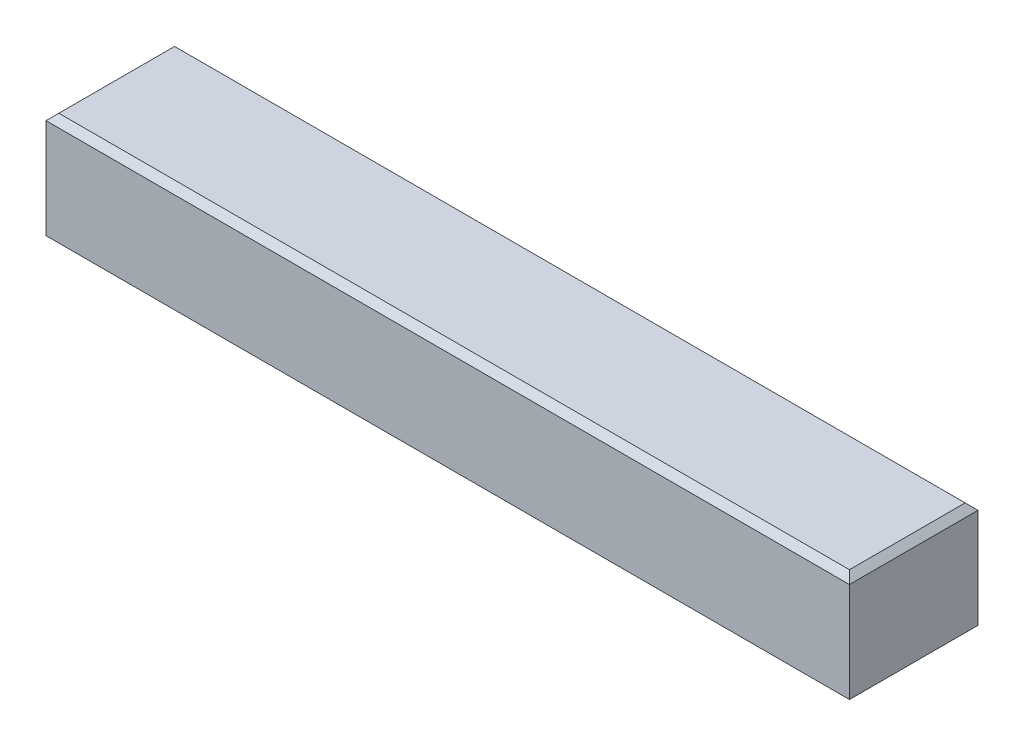
ISO-10303-21;
HEADER;
FILE_DESCRIPTION(('STEP AP214'),'2;1');
FILE_NAME('part.step','',(''),(''),'','','');
FILE_SCHEMA(('AUTOMOTIVE_DESIGN { 1 0 10303 214 1 1 1 1 }'));
ENDSEC;
DATA;
#1=APPLICATION_CONTEXT('core data for automotive mechanical design processes');
#2=APPLICATION_PROTOCOL_DEFINITION('international standard','automotive_design',2000,#1);
#3=PRODUCT_CONTEXT('',#1,'mechanical');
#4=PRODUCT('Part','Part','',(#3));
#5=PRODUCT_RELATED_PRODUCT_CATEGORY('part','',(#4));
#6=PRODUCT_DEFINITION_FORMATION('','',#4);
#7=PRODUCT_DEFINITION_CONTEXT('part definition',#1,'design');
#8=PRODUCT_DEFINITION('design','',#6,#7);
#9=PRODUCT_DEFINITION_SHAPE('','',#8);
#10=(LENGTH_UNIT() NAMED_UNIT(*) SI_UNIT(.MILLI.,.METRE.));
#11=(NAMED_UNIT(*) PLANE_ANGLE_UNIT() SI_UNIT($,.RADIAN.));
#12=(NAMED_UNIT(*) SI_UNIT($,.STERADIAN.) SOLID_ANGLE_UNIT());
#13=UNCERTAINTY_MEASURE_WITH_UNIT(LENGTH_MEASURE(1.E-05),#10,'distance_accuracy_value','');
#14=(GEOMETRIC_REPRESENTATION_CONTEXT(3) GLOBAL_UNCERTAINTY_ASSIGNED_CONTEXT((#13)) GLOBAL_UNIT_ASSIGNED_CONTEXT((#10,
#11,#12)) REPRESENTATION_CONTEXT('',''));
#15=CARTESIAN_POINT('',(0.,0.,0.));
#16=DIRECTION('',(0.,0.,1.));
#17=DIRECTION('',(1.,0.,0.));
#18=AXIS2_PLACEMENT_3D('',#15,#16,#17);
#19=CARTESIAN_POINT('',(0.,3.5,0.));
#20=DIRECTION('',(1.,0.,0.));
#21=DIRECTION('',(0.,0.,-1.));
#22=AXIS2_PLACEMENT_3D('',#19,#20,#21);
#23=PLANE('',#22);
#24=DIRECTION('',(0.,0.,-1.));
#25=VECTOR('',#24,1.);
#26=CARTESIAN_POINT('',(0.,6.6,2.));
#27=LINE('',#26,#25);
#28=CARTESIAN_POINT('',(0.,6.6,4.));
#29=VERTEX_POINT('',#28);
#30=CARTESIAN_POINT('',(0.,6.6,-4.));
#31=VERTEX_POINT('',#30);
#32=EDGE_CURVE('E147',#29,#31,#27,.T.);
#33=ORIENTED_EDGE('',*,*,#32,.T.);
#34=DIRECTION('',(0.,1.,0.));
#35=VECTOR('',#34,1.);
#36=CARTESIAN_POINT('',(0.,0.4,-4.));
#37=LINE('',#36,#35);
#38=CARTESIAN_POINT('',(0.,0.4,-4.));
#39=VERTEX_POINT('',#38);
#40=EDGE_CURVE('E11',#39,#31,#37,.T.);
#41=ORIENTED_EDGE('',*,*,#40,.F.);
#42=DIRECTION('',(0.,0.,1.));
#43=VECTOR('',#42,1.);
#44=CARTESIAN_POINT('',(0.,0.4,2.));
#45=LINE('',#44,#43);
#46=CARTESIAN_POINT('',(0.,0.4,4.));
#47=VERTEX_POINT('',#46);
#48=EDGE_CURVE('E133',#39,#47,#45,.T.);
#49=ORIENTED_EDGE('',*,*,#48,.T.);
#50=DIRECTION('',(0.,-1.,0.));
#51=VECTOR('',#50,1.);
#52=CARTESIAN_POINT('',(0.,6.6,4.));
#53=LINE('',#52,#51);
#54=EDGE_CURVE('E25',#29,#47,#53,.T.);
#55=ORIENTED_EDGE('',*,*,#54,.F.);
#56=EDGE_LOOP('',(#33,#41,#49,#55));
#57=FACE_BOUND('',#56,.T.);
#58=ADVANCED_FACE('F16',(#57),#23,.F.);
#59=CARTESIAN_POINT('',(0.,3.5,-4.));
#60=DIRECTION('',(0.,0.,-1.));
#61=DIRECTION('',(0.,1.,0.));
#62=AXIS2_PLACEMENT_3D('',#59,#60,#61);
#63=PLANE('',#62);
#64=DIRECTION('',(0.,-1.,0.));
#65=VECTOR('',#64,1.);
#66=CARTESIAN_POINT('',(50.,0.4,-4.));
#67=LINE('',#66,#65);
#68=CARTESIAN_POINT('',(50.,6.6,-4.));
#69=VERTEX_POINT('',#68);
#70=CARTESIAN_POINT('',(50.,0.4,-4.));
#71=VERTEX_POINT('',#70);
#72=EDGE_CURVE('E85',#69,#71,#67,.T.);
#73=ORIENTED_EDGE('',*,*,#72,.T.);
#74=DIRECTION('',(1.,0.,0.));
#75=VECTOR('',#74,1.);
#76=CARTESIAN_POINT('',(0.,0.4,-4.));
#77=LINE('',#76,#75);
#78=EDGE_CURVE('E131',#39,#71,#77,.T.);
#79=ORIENTED_EDGE('',*,*,#78,.F.);
#80=ORIENTED_EDGE('',*,*,#40,.T.);
#81=DIRECTION('',(1.,0.,0.));
#82=VECTOR('',#81,1.);
#83=CARTESIAN_POINT('',(0.,6.6,-4.));
#84=LINE('',#83,#82);
#85=EDGE_CURVE('E110',#31,#69,#84,.T.);
#86=ORIENTED_EDGE('',*,*,#85,.T.);
#87=EDGE_LOOP('',(#73,#79,#80,#86));
#88=FACE_BOUND('',#87,.T.);
#89=ADVANCED_FACE('F179',(#88),#63,.T.);
#90=CARTESIAN_POINT('',(0.,6.8,3.8));
#91=DIRECTION('',(0.,0.707106781186547,0.707106781186548));
#92=DIRECTION('',(0.,-0.707106781186548,0.707106781186547));
#93=AXIS2_PLACEMENT_3D('',#90,#91,#92);
#94=PLANE('',#93);
#95=DIRECTION('',(-0.577350269189626,-0.577350269189626,0.577350269189626));
#96=VECTOR('',#95,1.);
#97=CARTESIAN_POINT('',(0.133333333333333,6.73333333333333,3.86666666666666));
#98=LINE('',#97,#96);
#99=CARTESIAN_POINT('',(0.4,7.,3.6));
#100=VERTEX_POINT('',#99);
#101=EDGE_CURVE('E121',#100,#29,#98,.T.);
#102=ORIENTED_EDGE('',*,*,#101,.T.);
#103=DIRECTION('',(1.,0.,0.));
#104=VECTOR('',#103,1.);
#105=CARTESIAN_POINT('',(0.,6.6,4.));
#106=LINE('',#105,#104);
#107=CARTESIAN_POINT('',(50.,6.6,4.));
#108=VERTEX_POINT('',#107);
#109=EDGE_CURVE('E142',#29,#108,#106,.T.);
#110=ORIENTED_EDGE('',*,*,#109,.T.);
#111=DIRECTION('',(-0.577350269189623,0.577350269189627,-0.577350269189627));
#112=VECTOR('',#111,1.);
#113=CARTESIAN_POINT('',(41.5333333333334,15.0666666666667,-4.46666666666664));
#114=LINE('',#113,#112);
#115=CARTESIAN_POINT('',(49.6,7.,3.6));
#116=VERTEX_POINT('',#115);
#117=EDGE_CURVE('E101',#108,#116,#114,.T.);
#118=ORIENTED_EDGE('',*,*,#117,.T.);
#119=DIRECTION('',(1.,0.,0.));
#120=VECTOR('',#119,1.);
#121=CARTESIAN_POINT('',(0.,7.,3.6));
#122=LINE('',#121,#120);
#123=EDGE_CURVE('E98',#100,#116,#122,.T.);
#124=ORIENTED_EDGE('',*,*,#123,.F.);
#125=EDGE_LOOP('',(#102,#110,#118,#124));
#126=FACE_BOUND('',#125,.T.);
#127=ADVANCED_FACE('F157',(#126),#94,.T.);
#128=CARTESIAN_POINT('',(0.,3.5,4.));
#129=DIRECTION('',(0.,0.,1.));
#130=DIRECTION('',(0.,-1.,0.));
#131=AXIS2_PLACEMENT_3D('',#128,#129,#130);
#132=PLANE('',#131);
#133=DIRECTION('',(0.,1.,0.));
#134=VECTOR('',#133,1.);
#135=CARTESIAN_POINT('',(50.,6.6,4.));
#136=LINE('',#135,#134);
#137=CARTESIAN_POINT('',(50.,0.4,4.));
#138=VERTEX_POINT('',#137);
#139=EDGE_CURVE('E124',#138,#108,#136,.T.);
#140=ORIENTED_EDGE('',*,*,#139,.T.);
#141=ORIENTED_EDGE('',*,*,#109,.F.);
#142=ORIENTED_EDGE('',*,*,#54,.T.);
#143=DIRECTION('',(1.,0.,0.));
#144=VECTOR('',#143,1.);
#145=CARTESIAN_POINT('',(0.,0.4,4.));
#146=LINE('',#145,#144);
#147=EDGE_CURVE('E156',#47,#138,#146,.T.);
#148=ORIENTED_EDGE('',*,*,#147,.T.);
#149=EDGE_LOOP('',(#140,#141,#142,#148));
#150=FACE_BOUND('',#149,.T.);
#151=ADVANCED_FACE('F159',(#150),#132,.T.);
#152=CARTESIAN_POINT('',(0.,0.2,3.8));
#153=DIRECTION('',(0.,-0.707106781186548,0.707106781186548));
#154=DIRECTION('',(0.,-0.707106781186548,-0.707106781186548));
#155=AXIS2_PLACEMENT_3D('',#152,#153,#154);
#156=PLANE('',#155);
#157=DIRECTION('',(0.577350269189623,0.577350269189627,0.577350269189627));
#158=VECTOR('',#157,1.);
#159=CARTESIAN_POINT('',(41.5333333333334,-8.06666666666665,-4.46666666666665));
#160=LINE('',#159,#158);
#161=CARTESIAN_POINT('',(49.6,0.,3.6));
#162=VERTEX_POINT('',#161);
#163=EDGE_CURVE('E137',#162,#138,#160,.T.);
#164=ORIENTED_EDGE('',*,*,#163,.T.);
#165=ORIENTED_EDGE('',*,*,#147,.F.);
#166=DIRECTION('',(0.577350269189626,-0.577350269189626,-0.577350269189626));
#167=VECTOR('',#166,1.);
#168=CARTESIAN_POINT('',(0.133333333333333,0.266666666666666,3.86666666666666));
#169=LINE('',#168,#167);
#170=CARTESIAN_POINT('',(0.4,0.,3.6));
#171=VERTEX_POINT('',#170);
#172=EDGE_CURVE('E136',#47,#171,#169,.T.);
#173=ORIENTED_EDGE('',*,*,#172,.T.);
#174=DIRECTION('',(1.,0.,0.));
#175=VECTOR('',#174,1.);
#176=CARTESIAN_POINT('',(0.,0.,3.6));
#177=LINE('',#176,#175);
#178=EDGE_CURVE('E19',#171,#162,#177,.T.);
#179=ORIENTED_EDGE('',*,*,#178,.T.);
#180=EDGE_LOOP('',(#164,#165,#173,#179));
#181=FACE_BOUND('',#180,.T.);
#182=ADVANCED_FACE('F168',(#181),#156,.T.);
#183=CARTESIAN_POINT('',(0.2,0.2,4.));
#184=DIRECTION('',(0.707106781186548,0.707106781186548,0.));
#185=DIRECTION('',(0.707106781186548,-0.707106781186548,0.));
#186=AXIS2_PLACEMENT_3D('',#183,#184,#185);
#187=PLANE('',#186);
#188=ORIENTED_EDGE('',*,*,#48,.F.);
#189=DIRECTION('',(-0.577350269189626,0.577350269189626,-0.577350269189626));
#190=VECTOR('',#189,1.);
#191=CARTESIAN_POINT('',(1.46666666666667,-1.06666666666667,-2.53333333333333));
#192=LINE('',#191,#190);
#193=CARTESIAN_POINT('',(0.4,0.,-3.6));
#194=VERTEX_POINT('',#193);
#195=EDGE_CURVE('E127',#194,#39,#192,.T.);
#196=ORIENTED_EDGE('',*,*,#195,.F.);
#197=DIRECTION('',(0.,0.,-1.));
#198=VECTOR('',#197,1.);
#199=CARTESIAN_POINT('',(0.4,0.,2.));
#200=LINE('',#199,#198);
#201=EDGE_CURVE('E54',#171,#194,#200,.T.);
#202=ORIENTED_EDGE('',*,*,#201,.F.);
#203=ORIENTED_EDGE('',*,*,#172,.F.);
#204=EDGE_LOOP('',(#188,#196,#202,#203));
#205=FACE_BOUND('',#204,.T.);
#206=ADVANCED_FACE('F184',(#205),#187,.F.);
#207=CARTESIAN_POINT('',(0.,0.,0.));
#208=DIRECTION('',(0.,-1.,0.));
#209=DIRECTION('',(0.,0.,-1.));
#210=AXIS2_PLACEMENT_3D('',#207,#208,#209);
#211=PLANE('',#210);
#212=DIRECTION('',(0.,0.,1.));
#213=VECTOR('',#212,1.);
#214=CARTESIAN_POINT('',(49.6,0.,2.));
#215=LINE('',#214,#213);
#216=CARTESIAN_POINT('',(49.6,0.,-3.6));
#217=VERTEX_POINT('',#216);
#218=EDGE_CURVE('E130',#217,#162,#215,.T.);
#219=ORIENTED_EDGE('',*,*,#218,.T.);
#220=ORIENTED_EDGE('',*,*,#178,.F.);
#221=ORIENTED_EDGE('',*,*,#201,.T.);
#222=DIRECTION('',(1.,0.,0.));
#223=VECTOR('',#222,1.);
#224=CARTESIAN_POINT('',(0.,0.,-3.6));
#225=LINE('',#224,#223);
#226=EDGE_CURVE('E61',#194,#217,#225,.T.);
#227=ORIENTED_EDGE('',*,*,#226,.T.);
#228=EDGE_LOOP('',(#219,#220,#221,#227));
#229=FACE_BOUND('',#228,.T.);
#230=ADVANCED_FACE('F173',(#229),#211,.T.);
#231=CARTESIAN_POINT('',(0.,0.2,-3.8));
#232=DIRECTION('',(0.,-0.707106781186548,-0.707106781186547));
#233=DIRECTION('',(0.,0.707106781186547,-0.707106781186548));
#234=AXIS2_PLACEMENT_3D('',#231,#232,#233);
#235=PLANE('',#234);
#236=DIRECTION('',(-0.577350269189623,-0.577350269189627,0.577350269189627));
#237=VECTOR('',#236,1.);
#238=CARTESIAN_POINT('',(40.2,-9.4,5.8));
#239=LINE('',#238,#237);
#240=EDGE_CURVE('E128',#71,#217,#239,.T.);
#241=ORIENTED_EDGE('',*,*,#240,.T.);
#242=ORIENTED_EDGE('',*,*,#226,.F.);
#243=ORIENTED_EDGE('',*,*,#195,.T.);
#244=ORIENTED_EDGE('',*,*,#78,.T.);
#245=EDGE_LOOP('',(#241,#242,#243,#244));
#246=FACE_BOUND('',#245,.T.);
#247=ADVANCED_FACE('F181',(#246),#235,.T.);
#248=CARTESIAN_POINT('',(49.8,0.2,4.));
#249=DIRECTION('',(-0.70710678118655,0.707106781186545,0.));
#250=DIRECTION('',(0.707106781186545,0.70710678118655,0.));
#251=AXIS2_PLACEMENT_3D('',#248,#249,#250);
#252=PLANE('',#251);
#253=DIRECTION('',(0.,0.,-1.));
#254=VECTOR('',#253,1.);
#255=CARTESIAN_POINT('',(50.,0.400000000000005,2.));
#256=LINE('',#255,#254);
#257=EDGE_CURVE('E123',#138,#71,#256,.T.);
#258=ORIENTED_EDGE('',*,*,#257,.F.);
#259=ORIENTED_EDGE('',*,*,#163,.F.);
#260=ORIENTED_EDGE('',*,*,#218,.F.);
#261=ORIENTED_EDGE('',*,*,#240,.F.);
#262=EDGE_LOOP('',(#258,#259,#260,#261));
#263=FACE_BOUND('',#262,.T.);
#264=ADVANCED_FACE('F176',(#263),#252,.F.);
#265=CARTESIAN_POINT('',(50.,3.5,0.));
#266=DIRECTION('',(1.,0.,0.));
#267=DIRECTION('',(0.,0.,-1.));
#268=AXIS2_PLACEMENT_3D('',#265,#266,#267);
#269=PLANE('',#268);
#270=DIRECTION('',(0.,0.,1.));
#271=VECTOR('',#270,1.);
#272=CARTESIAN_POINT('',(50.,6.6,2.));
#273=LINE('',#272,#271);
#274=EDGE_CURVE('E106',#69,#108,#273,.T.);
#275=ORIENTED_EDGE('',*,*,#274,.T.);
#276=ORIENTED_EDGE('',*,*,#139,.F.);
#277=ORIENTED_EDGE('',*,*,#257,.T.);
#278=ORIENTED_EDGE('',*,*,#72,.F.);
#279=EDGE_LOOP('',(#275,#276,#277,#278));
#280=FACE_BOUND('',#279,.T.);
#281=ADVANCED_FACE('F161',(#280),#269,.T.);
#282=CARTESIAN_POINT('',(49.8,6.8,4.));
#283=DIRECTION('',(-0.70710678118655,-0.707106781186545,0.));
#284=DIRECTION('',(-0.707106781186545,0.70710678118655,0.));
#285=AXIS2_PLACEMENT_3D('',#282,#283,#284);
#286=PLANE('',#285);
#287=ORIENTED_EDGE('',*,*,#117,.F.);
#288=ORIENTED_EDGE('',*,*,#274,.F.);
#289=DIRECTION('',(0.577350269189623,-0.577350269189627,-0.577350269189627));
#290=VECTOR('',#289,1.);
#291=CARTESIAN_POINT('',(40.2,16.4,5.8));
#292=LINE('',#291,#290);
#293=CARTESIAN_POINT('',(49.6,7.,-3.6));
#294=VERTEX_POINT('',#293);
#295=EDGE_CURVE('E104',#294,#69,#292,.T.);
#296=ORIENTED_EDGE('',*,*,#295,.F.);
#297=DIRECTION('',(0.,0.,-1.));
#298=VECTOR('',#297,1.);
#299=CARTESIAN_POINT('',(49.6,7.,2.));
#300=LINE('',#299,#298);
#301=EDGE_CURVE('E91',#116,#294,#300,.T.);
#302=ORIENTED_EDGE('',*,*,#301,.F.);
#303=EDGE_LOOP('',(#287,#288,#296,#302));
#304=FACE_BOUND('',#303,.T.);
#305=ADVANCED_FACE('F105',(#304),#286,.F.);
#306=CARTESIAN_POINT('',(0.,7.,0.));
#307=DIRECTION('',(0.,1.,0.));
#308=DIRECTION('',(0.,0.,1.));
#309=AXIS2_PLACEMENT_3D('',#306,#307,#308);
#310=PLANE('',#309);
#311=DIRECTION('',(0.,0.,1.));
#312=VECTOR('',#311,1.);
#313=CARTESIAN_POINT('',(0.4,7.,2.));
#314=LINE('',#313,#312);
#315=CARTESIAN_POINT('',(0.4,7.,-3.6));
#316=VERTEX_POINT('',#315);
#317=EDGE_CURVE('E117',#316,#100,#314,.T.);
#318=ORIENTED_EDGE('',*,*,#317,.T.);
#319=ORIENTED_EDGE('',*,*,#123,.T.);
#320=ORIENTED_EDGE('',*,*,#301,.T.);
#321=DIRECTION('',(1.,0.,0.));
#322=VECTOR('',#321,1.);
#323=CARTESIAN_POINT('',(0.,7.,-3.6));
#324=LINE('',#323,#322);
#325=EDGE_CURVE('E96',#316,#294,#324,.T.);
#326=ORIENTED_EDGE('',*,*,#325,.F.);
#327=EDGE_LOOP('',(#318,#319,#320,#326));
#328=FACE_BOUND('',#327,.T.);
#329=ADVANCED_FACE('F94',(#328),#310,.T.);
#330=CARTESIAN_POINT('',(0.,6.8,-3.8));
#331=DIRECTION('',(0.,0.707106781186548,-0.707106781186548));
#332=DIRECTION('',(0.,0.707106781186548,0.707106781186548));
#333=AXIS2_PLACEMENT_3D('',#330,#331,#332);
#334=PLANE('',#333);
#335=DIRECTION('',(0.577350269189626,0.577350269189626,0.577350269189626));
#336=VECTOR('',#335,1.);
#337=CARTESIAN_POINT('',(1.46666666666667,8.06666666666667,-2.53333333333333));
#338=LINE('',#337,#336);
#339=EDGE_CURVE('E114',#31,#316,#338,.T.);
#340=ORIENTED_EDGE('',*,*,#339,.T.);
#341=ORIENTED_EDGE('',*,*,#325,.T.);
#342=ORIENTED_EDGE('',*,*,#295,.T.);
#343=ORIENTED_EDGE('',*,*,#85,.F.);
#344=EDGE_LOOP('',(#340,#341,#342,#343));
#345=FACE_BOUND('',#344,.T.);
#346=ADVANCED_FACE('F112',(#345),#334,.T.);
#347=CARTESIAN_POINT('',(0.2,6.8,4.));
#348=DIRECTION('',(0.707106781186548,-0.707106781186547,0.));
#349=DIRECTION('',(-0.707106781186547,-0.707106781186548,0.));
#350=AXIS2_PLACEMENT_3D('',#347,#348,#349);
#351=PLANE('',#350);
#352=ORIENTED_EDGE('',*,*,#32,.F.);
#353=ORIENTED_EDGE('',*,*,#101,.F.);
#354=ORIENTED_EDGE('',*,*,#317,.F.);
#355=ORIENTED_EDGE('',*,*,#339,.F.);
#356=EDGE_LOOP('',(#352,#353,#354,#355));
#357=FACE_BOUND('',#356,.T.);
#358=ADVANCED_FACE('F200',(#357),#351,.F.);
#359=CLOSED_SHELL('',(#58,#89,#127,#151,#182,#206,#230,#247,#264,#281,#305,#329,#346,#358));
#360=MANIFOLD_SOLID_BREP('B1',#359);
#361=ADVANCED_BREP_SHAPE_REPRESENTATION('',(#18,#360),#14);
#362=SHAPE_DEFINITION_REPRESENTATION(#9,#361);
ENDSEC;
END-ISO-10303-21;
